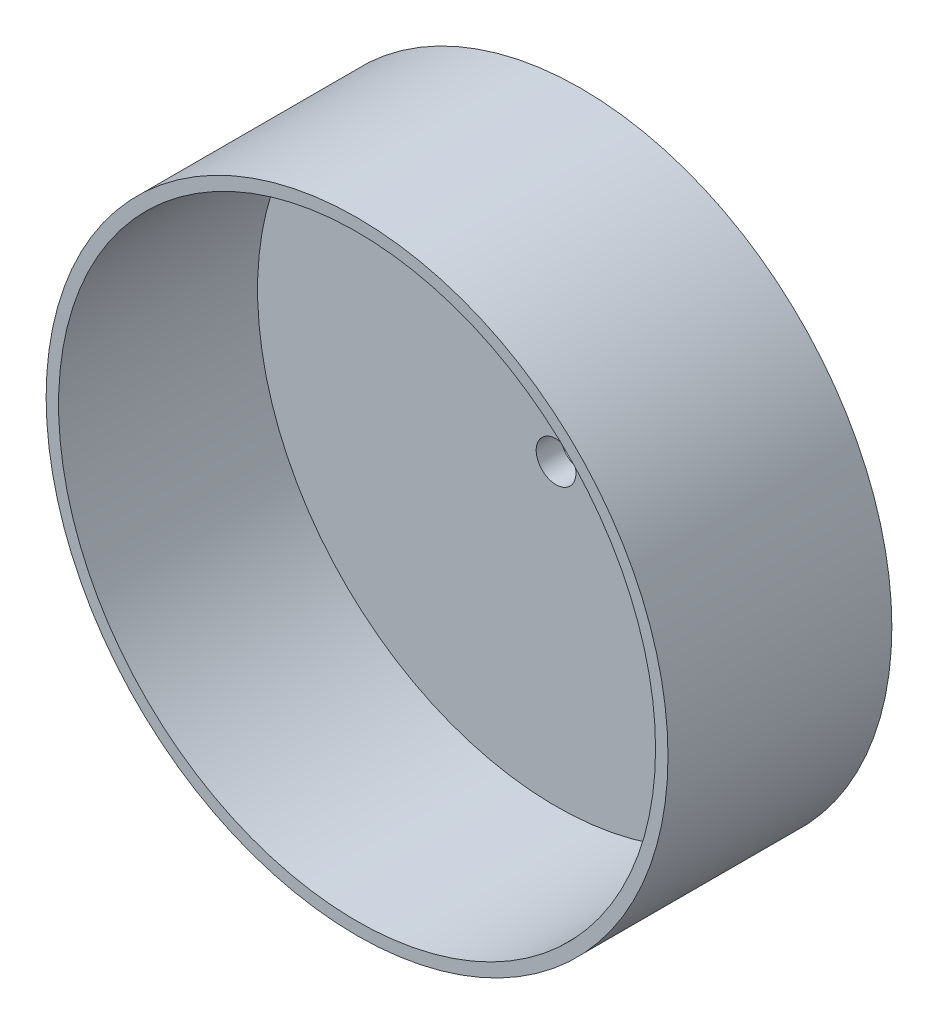
ISO-10303-21;
HEADER;
FILE_DESCRIPTION(('STEP AP214'),'2;1');
FILE_NAME('part.step','',(''),(''),'','','');
FILE_SCHEMA(('AUTOMOTIVE_DESIGN { 1 0 10303 214 1 1 1 1 }'));
ENDSEC;
DATA;
#1=APPLICATION_CONTEXT('core data for automotive mechanical design processes');
#2=APPLICATION_PROTOCOL_DEFINITION('international standard','automotive_design',2000,#1);
#3=PRODUCT_CONTEXT('',#1,'mechanical');
#4=PRODUCT('Part','Part','',(#3));
#5=PRODUCT_RELATED_PRODUCT_CATEGORY('part','',(#4));
#6=PRODUCT_DEFINITION_FORMATION('','',#4);
#7=PRODUCT_DEFINITION_CONTEXT('part definition',#1,'design');
#8=PRODUCT_DEFINITION('design','',#6,#7);
#9=PRODUCT_DEFINITION_SHAPE('','',#8);
#10=(LENGTH_UNIT() NAMED_UNIT(*) SI_UNIT(.MILLI.,.METRE.));
#11=(NAMED_UNIT(*) PLANE_ANGLE_UNIT() SI_UNIT($,.RADIAN.));
#12=(NAMED_UNIT(*) SI_UNIT($,.STERADIAN.) SOLID_ANGLE_UNIT());
#13=UNCERTAINTY_MEASURE_WITH_UNIT(LENGTH_MEASURE(1.E-05),#10,'distance_accuracy_value','');
#14=(GEOMETRIC_REPRESENTATION_CONTEXT(3) GLOBAL_UNCERTAINTY_ASSIGNED_CONTEXT((#13)) GLOBAL_UNIT_ASSIGNED_CONTEXT((#10,
#11,#12)) REPRESENTATION_CONTEXT('',''));
#15=CARTESIAN_POINT('',(0.,0.,0.));
#16=DIRECTION('',(0.,0.,1.));
#17=DIRECTION('',(1.,0.,0.));
#18=AXIS2_PLACEMENT_3D('',#15,#16,#17);
#19=CARTESIAN_POINT('',(0.,0.,45.));
#20=DIRECTION('',(0.,0.,-1.));
#21=DIRECTION('',(-1.,0.,0.));
#22=AXIS2_PLACEMENT_3D('',#19,#20,#21);
#23=CYLINDRICAL_SURFACE('',#22,4.);
#24=CARTESIAN_POINT('',(0.,0.,0.));
#25=DIRECTION('',(0.,0.,1.));
#26=DIRECTION('',(1.,0.,0.));
#27=AXIS2_PLACEMENT_3D('',#24,#25,#26);
#28=CIRCLE('',#27,4.);
#29=CARTESIAN_POINT('',(-4.,0.,0.));
#30=VERTEX_POINT('',#29);
#31=EDGE_CURVE('E52',#30,#30,#28,.T.);
#32=CARTESIAN_POINT('',(0.,0.,5.));
#33=DIRECTION('',(0.,0.,1.));
#34=DIRECTION('',(1.,0.,0.));
#35=AXIS2_PLACEMENT_3D('',#32,#33,#34);
#36=CIRCLE('',#35,4.);
#37=CARTESIAN_POINT('',(-4.,0.,5.));
#38=VERTEX_POINT('',#37);
#39=EDGE_CURVE('E41',#38,#38,#36,.T.);
#40=CARTESIAN_POINT('',(-4.,0.,0.));
#41=CARTESIAN_POINT('',(-4.,0.,0.0520833333333253));
#42=CARTESIAN_POINT('',(-4.,0.,0.104166666666657));
#43=CARTESIAN_POINT('',(-4.,0.,0.208333333333324));
#44=CARTESIAN_POINT('',(-4.,0.,0.260416666666659));
#45=CARTESIAN_POINT('',(-4.,0.,0.364583333333328));
#46=CARTESIAN_POINT('',(-4.,0.,0.416666666666662));
#47=CARTESIAN_POINT('',(-4.,0.,0.520833333333329));
#48=CARTESIAN_POINT('',(-4.,0.,0.572916666666661));
#49=CARTESIAN_POINT('',(-4.,0.,0.677083333333326));
#50=CARTESIAN_POINT('',(-4.,0.,0.729166666666658));
#51=CARTESIAN_POINT('',(-4.,0.,0.833333333333325));
#52=CARTESIAN_POINT('',(-4.,0.,0.885416666666659));
#53=CARTESIAN_POINT('',(-4.,0.,0.989583333333328));
#54=CARTESIAN_POINT('',(-4.,0.,1.04166666666666));
#55=CARTESIAN_POINT('',(-4.,0.,1.14583333333333));
#56=CARTESIAN_POINT('',(-4.,0.,1.19791666666666));
#57=CARTESIAN_POINT('',(-4.,0.,1.30208333333333));
#58=CARTESIAN_POINT('',(-4.,0.,1.35416666666666));
#59=CARTESIAN_POINT('',(-4.,0.,1.45833333333333));
#60=CARTESIAN_POINT('',(-4.,0.,1.51041666666666));
#61=CARTESIAN_POINT('',(-4.,0.,1.61458333333333));
#62=CARTESIAN_POINT('',(-4.,0.,1.66666666666666));
#63=CARTESIAN_POINT('',(-4.,0.,1.77083333333333));
#64=CARTESIAN_POINT('',(-4.,0.,1.82291666666666));
#65=CARTESIAN_POINT('',(-4.,0.,1.92708333333333));
#66=CARTESIAN_POINT('',(-4.,0.,1.97916666666666));
#67=CARTESIAN_POINT('',(-4.,0.,2.08333333333333));
#68=CARTESIAN_POINT('',(-4.,0.,2.13541666666666));
#69=CARTESIAN_POINT('',(-4.,0.,2.23958333333333));
#70=CARTESIAN_POINT('',(-4.,0.,2.29166666666666));
#71=CARTESIAN_POINT('',(-4.,0.,2.39583333333333));
#72=CARTESIAN_POINT('',(-4.,0.,2.44791666666666));
#73=CARTESIAN_POINT('',(-4.,0.,2.55208333333333));
#74=CARTESIAN_POINT('',(-4.,0.,2.60416666666666));
#75=CARTESIAN_POINT('',(-4.,0.,2.70833333333333));
#76=CARTESIAN_POINT('',(-4.,0.,2.76041666666666));
#77=CARTESIAN_POINT('',(-4.,0.,2.86458333333333));
#78=CARTESIAN_POINT('',(-4.,0.,2.91666666666666));
#79=CARTESIAN_POINT('',(-4.,0.,3.02083333333333));
#80=CARTESIAN_POINT('',(-4.,0.,3.07291666666666));
#81=CARTESIAN_POINT('',(-4.,0.,3.17708333333333));
#82=CARTESIAN_POINT('',(-4.,0.,3.22916666666666));
#83=CARTESIAN_POINT('',(-4.,0.,3.33333333333333));
#84=CARTESIAN_POINT('',(-4.,0.,3.38541666666666));
#85=CARTESIAN_POINT('',(-4.,0.,3.48958333333333));
#86=CARTESIAN_POINT('',(-4.,0.,3.54166666666667));
#87=CARTESIAN_POINT('',(-4.,0.,3.64583333333333));
#88=CARTESIAN_POINT('',(-4.,0.,3.69791666666666));
#89=CARTESIAN_POINT('',(-4.,0.,3.80208333333333));
#90=CARTESIAN_POINT('',(-4.,0.,3.85416666666666));
#91=CARTESIAN_POINT('',(-4.,0.,3.95833333333333));
#92=CARTESIAN_POINT('',(-4.,0.,4.01041666666666));
#93=CARTESIAN_POINT('',(-4.,0.,4.11458333333333));
#94=CARTESIAN_POINT('',(-4.,0.,4.16666666666667));
#95=CARTESIAN_POINT('',(-4.,0.,4.27083333333333));
#96=CARTESIAN_POINT('',(-4.,0.,4.32291666666667));
#97=CARTESIAN_POINT('',(-4.,0.,4.42708333333333));
#98=CARTESIAN_POINT('',(-4.,0.,4.47916666666666));
#99=CARTESIAN_POINT('',(-4.,0.,4.58333333333333));
#100=CARTESIAN_POINT('',(-4.,0.,4.63541666666666));
#101=CARTESIAN_POINT('',(-4.,0.,4.73958333333333));
#102=CARTESIAN_POINT('',(-4.,0.,4.79166666666667));
#103=CARTESIAN_POINT('',(-4.,0.,4.89583333333333));
#104=CARTESIAN_POINT('',(-4.,0.,4.94791666666667));
#105=CARTESIAN_POINT('',(-4.,0.,5.));
#106=B_SPLINE_CURVE_WITH_KNOTS('',3,(#40,#41,#42,#43,#44,#45,#46,#47,#48,#49,#50,#51,#52,#53,
#54,#55,#56,#57,#58,#59,#60,#61,#62,#63,#64,#65,#66,#67,#68,#69,#70,#71,#72,#73,#74,#75,#76,#77,
#78,#79,#80,#81,#82,#83,#84,#85,#86,#87,#88,#89,#90,#91,#92,#93,#94,#95,#96,#97,#98,#99,#100,
#101,#102,#103,#104,#105),.UNSPECIFIED.,.F.,.F.,(4,2,2,2,2,2,2,2,2,2,2,2,2,2,2,2,2,2,2,2,2,2,2,
2,2,2,2,2,2,2,2,2,4),(0.,0.156249999999997,0.3125,0.468750000000004,0.625000000000001,
0.781249999999997,0.937500000000001,1.09375,1.25,1.40625,1.5625,1.71875,1.875,2.03125,2.1875,
2.34375000000001,2.5,2.65625,2.8125,2.96875000000001,3.125,3.28125,3.4375,3.59375000000001,3.75,
3.90625,4.0625,4.21875000000001,4.375,4.53125,4.6875,4.84375000000001,5.),.UNSPECIFIED.);
#107=EDGE_CURVE('BSEAM37',#30,#38,#106,.T.);
#108=ORIENTED_EDGE('',*,*,#31,.F.);
#109=ORIENTED_EDGE('',*,*,#39,.T.);
#110=ORIENTED_EDGE('',*,*,#107,.T.);
#111=ORIENTED_EDGE('',*,*,#107,.F.);
#112=EDGE_LOOP('',(#108,#110,#109,#111));
#113=FACE_BOUND('',#112,.T.);
#114=ADVANCED_FACE('F37',(#113),#23,.F.);
#115=CARTESIAN_POINT('',(0.,0.,45.));
#116=DIRECTION('',(0.,0.,1.));
#117=DIRECTION('',(1.,0.,0.));
#118=AXIS2_PLACEMENT_3D('',#115,#116,#117);
#119=PLANE('',#118);
#120=CARTESIAN_POINT('',(0.,0.,45.));
#121=DIRECTION('',(0.,0.,1.));
#122=DIRECTION('',(1.,0.,0.));
#123=AXIS2_PLACEMENT_3D('',#120,#121,#122);
#124=CIRCLE('',#123,60.);
#125=CARTESIAN_POINT('',(60.,0.,45.));
#126=VERTEX_POINT('',#125);
#127=EDGE_CURVE('E57',#126,#126,#124,.T.);
#128=ORIENTED_EDGE('',*,*,#127,.F.);
#129=EDGE_LOOP('',(#128));
#130=FACE_BOUND('',#129,.T.);
#131=CARTESIAN_POINT('',(0.,0.,45.));
#132=DIRECTION('',(0.,0.,1.));
#133=DIRECTION('',(1.,0.,0.));
#134=AXIS2_PLACEMENT_3D('',#131,#132,#133);
#135=CIRCLE('',#134,62.5);
#136=CARTESIAN_POINT('',(-62.5,0.,45.));
#137=VERTEX_POINT('',#136);
#138=EDGE_CURVE('E10',#137,#137,#135,.T.);
#139=ORIENTED_EDGE('',*,*,#138,.T.);
#140=EDGE_LOOP('',(#139));
#141=FACE_BOUND('',#140,.T.);
#142=ADVANCED_FACE('F81',(#130,#141),#119,.T.);
#143=CARTESIAN_POINT('',(0.,0.,0.));
#144=DIRECTION('',(0.,0.,1.));
#145=DIRECTION('',(1.,0.,0.));
#146=AXIS2_PLACEMENT_3D('',#143,#144,#145);
#147=PLANE('',#146);
#148=CARTESIAN_POINT('',(0.,0.,0.));
#149=DIRECTION('',(0.,0.,1.));
#150=DIRECTION('',(1.,0.,0.));
#151=AXIS2_PLACEMENT_3D('',#148,#149,#150);
#152=CIRCLE('',#151,62.5);
#153=CARTESIAN_POINT('',(-62.5,0.,0.));
#154=VERTEX_POINT('',#153);
#155=EDGE_CURVE('E46',#154,#154,#152,.T.);
#156=ORIENTED_EDGE('',*,*,#155,.F.);
#157=EDGE_LOOP('',(#156));
#158=FACE_BOUND('',#157,.T.);
#159=ORIENTED_EDGE('',*,*,#31,.T.);
#160=EDGE_LOOP('',(#159));
#161=FACE_BOUND('',#160,.T.);
#162=ADVANCED_FACE('F87',(#158,#161),#147,.F.);
#163=CARTESIAN_POINT('',(0.,0.,45.));
#164=DIRECTION('',(0.,0.,-1.));
#165=DIRECTION('',(-1.,0.,0.));
#166=AXIS2_PLACEMENT_3D('',#163,#164,#165);
#167=CYLINDRICAL_SURFACE('',#166,62.5);
#168=CARTESIAN_POINT('',(-62.5,0.,45.));
#169=CARTESIAN_POINT('',(-62.5,0.,44.53125));
#170=CARTESIAN_POINT('',(-62.5,0.,44.0625));
#171=CARTESIAN_POINT('',(-62.5,0.,43.125));
#172=CARTESIAN_POINT('',(-62.5,0.,42.65625));
#173=CARTESIAN_POINT('',(-62.5,0.,41.71875));
#174=CARTESIAN_POINT('',(-62.5,0.,41.25));
#175=CARTESIAN_POINT('',(-62.5,0.,40.3125));
#176=CARTESIAN_POINT('',(-62.5,0.,39.84375));
#177=CARTESIAN_POINT('',(-62.5,0.,38.90625));
#178=CARTESIAN_POINT('',(-62.5,0.,38.4375));
#179=CARTESIAN_POINT('',(-62.5,0.,37.5));
#180=CARTESIAN_POINT('',(-62.5,0.,37.03125));
#181=CARTESIAN_POINT('',(-62.5,0.,36.09375));
#182=CARTESIAN_POINT('',(-62.5,0.,35.625));
#183=CARTESIAN_POINT('',(-62.5,0.,34.6875));
#184=CARTESIAN_POINT('',(-62.5,0.,34.21875));
#185=CARTESIAN_POINT('',(-62.5,0.,33.28125));
#186=CARTESIAN_POINT('',(-62.5,0.,32.8125));
#187=CARTESIAN_POINT('',(-62.5,0.,31.875));
#188=CARTESIAN_POINT('',(-62.5,0.,31.40625));
#189=CARTESIAN_POINT('',(-62.5,0.,30.46875));
#190=CARTESIAN_POINT('',(-62.5,0.,30.));
#191=CARTESIAN_POINT('',(-62.5,0.,29.0625));
#192=CARTESIAN_POINT('',(-62.5,0.,28.59375));
#193=CARTESIAN_POINT('',(-62.5,0.,27.65625));
#194=CARTESIAN_POINT('',(-62.5,0.,27.1875));
#195=CARTESIAN_POINT('',(-62.5,0.,26.25));
#196=CARTESIAN_POINT('',(-62.5,0.,25.78125));
#197=CARTESIAN_POINT('',(-62.5,0.,24.84375));
#198=CARTESIAN_POINT('',(-62.5,0.,24.375));
#199=CARTESIAN_POINT('',(-62.5,0.,23.4375));
#200=CARTESIAN_POINT('',(-62.5,0.,22.96875));
#201=CARTESIAN_POINT('',(-62.5,0.,22.03125));
#202=CARTESIAN_POINT('',(-62.5,0.,21.5625));
#203=CARTESIAN_POINT('',(-62.5,0.,20.625));
#204=CARTESIAN_POINT('',(-62.5,0.,20.15625));
#205=CARTESIAN_POINT('',(-62.5,0.,19.21875));
#206=CARTESIAN_POINT('',(-62.5,0.,18.75));
#207=CARTESIAN_POINT('',(-62.5,0.,17.8125));
#208=CARTESIAN_POINT('',(-62.5,0.,17.34375));
#209=CARTESIAN_POINT('',(-62.5,0.,16.40625));
#210=CARTESIAN_POINT('',(-62.5,0.,15.9375));
#211=CARTESIAN_POINT('',(-62.5,0.,15.));
#212=CARTESIAN_POINT('',(-62.5,0.,14.53125));
#213=CARTESIAN_POINT('',(-62.5,0.,13.59375));
#214=CARTESIAN_POINT('',(-62.5,0.,13.125));
#215=CARTESIAN_POINT('',(-62.5,0.,12.1875));
#216=CARTESIAN_POINT('',(-62.5,0.,11.71875));
#217=CARTESIAN_POINT('',(-62.5,0.,10.78125));
#218=CARTESIAN_POINT('',(-62.5,0.,10.3125));
#219=CARTESIAN_POINT('',(-62.5,0.,9.37499999999999));
#220=CARTESIAN_POINT('',(-62.5,0.,8.90624999999999));
#221=CARTESIAN_POINT('',(-62.5,0.,7.96874999999999));
#222=CARTESIAN_POINT('',(-62.5,0.,7.5));
#223=CARTESIAN_POINT('',(-62.5,0.,6.56249999999999));
#224=CARTESIAN_POINT('',(-62.5,0.,6.09374999999999));
#225=CARTESIAN_POINT('',(-62.5,0.,5.15624999999999));
#226=CARTESIAN_POINT('',(-62.5,0.,4.68749999999999));
#227=CARTESIAN_POINT('',(-62.5,0.,3.74999999999999));
#228=CARTESIAN_POINT('',(-62.5,0.,3.28124999999999));
#229=CARTESIAN_POINT('',(-62.5,0.,2.34374999999999));
#230=CARTESIAN_POINT('',(-62.5,0.,1.87499999999999));
#231=CARTESIAN_POINT('',(-62.5,0.,0.937499999999992));
#232=CARTESIAN_POINT('',(-62.5,0.,0.468749999999993));
#233=CARTESIAN_POINT('',(-62.5,0.,0.));
#234=B_SPLINE_CURVE_WITH_KNOTS('',3,(#168,#169,#170,#171,#172,#173,#174,#175,#176,#177,#178,
#179,#180,#181,#182,#183,#184,#185,#186,#187,#188,#189,#190,#191,#192,#193,#194,#195,#196,#197,
#198,#199,#200,#201,#202,#203,#204,#205,#206,#207,#208,#209,#210,#211,#212,#213,#214,#215,#216,
#217,#218,#219,#220,#221,#222,#223,#224,#225,#226,#227,#228,#229,#230,#231,#232,#233),
.UNSPECIFIED.,.F.,.F.,(4,2,2,2,2,2,2,2,2,2,2,2,2,2,2,2,2,2,2,2,2,2,2,2,2,2,2,2,2,2,2,2,4),(0.,
1.40625,2.8125,4.21874999999999,5.625,7.03125,8.43749999999999,9.84375,11.25,12.65625,14.0625,
15.46875,16.875,18.28125,19.6875,21.09375,22.5,23.90625,25.3125,26.71875,28.125,29.53125,
30.9375,32.34375,33.75,35.15625,36.5625,37.96875,39.375,40.78125,42.1875,43.59375,45.),.UNSPECIFIED.);
#235=EDGE_CURVE('BSEAM39',#137,#154,#234,.T.);
#236=ORIENTED_EDGE('',*,*,#138,.F.);
#237=ORIENTED_EDGE('',*,*,#155,.T.);
#238=ORIENTED_EDGE('',*,*,#235,.T.);
#239=ORIENTED_EDGE('',*,*,#235,.F.);
#240=EDGE_LOOP('',(#236,#238,#237,#239));
#241=FACE_BOUND('',#240,.T.);
#242=ADVANCED_FACE('F39',(#241),#167,.T.);
#243=CARTESIAN_POINT('',(0.,0.,5.));
#244=DIRECTION('',(0.,0.,1.));
#245=DIRECTION('',(1.,0.,0.));
#246=AXIS2_PLACEMENT_3D('',#243,#244,#245);
#247=CYLINDRICAL_SURFACE('',#246,60.);
#248=CARTESIAN_POINT('',(0.,0.,5.));
#249=DIRECTION('',(0.,0.,1.));
#250=DIRECTION('',(1.,0.,0.));
#251=AXIS2_PLACEMENT_3D('',#248,#249,#250);
#252=CIRCLE('',#251,60.);
#253=CARTESIAN_POINT('',(60.,0.,5.));
#254=VERTEX_POINT('',#253);
#255=EDGE_CURVE('E61',#254,#254,#252,.T.);
#256=ORIENTED_EDGE('',*,*,#255,.F.);
#257=EDGE_LOOP('',(#256));
#258=FACE_BOUND('',#257,.T.);
#259=ORIENTED_EDGE('',*,*,#127,.T.);
#260=EDGE_LOOP('',(#259));
#261=FACE_BOUND('',#260,.T.);
#262=ADVANCED_FACE('F73',(#258,#261),#247,.F.);
#263=CARTESIAN_POINT('',(0.,0.,5.));
#264=DIRECTION('',(0.,0.,1.));
#265=DIRECTION('',(1.,0.,0.));
#266=AXIS2_PLACEMENT_3D('',#263,#264,#265);
#267=PLANE('',#266);
#268=ORIENTED_EDGE('',*,*,#39,.F.);
#269=EDGE_LOOP('',(#268));
#270=FACE_BOUND('',#269,.T.);
#271=ORIENTED_EDGE('',*,*,#255,.T.);
#272=EDGE_LOOP('',(#271));
#273=FACE_BOUND('',#272,.T.);
#274=ADVANCED_FACE('F71',(#270,#273),#267,.T.);
#275=CLOSED_SHELL('',(#114,#142,#162,#242,#262,#274));
#276=MANIFOLD_SOLID_BREP('B2',#275);
#277=ADVANCED_BREP_SHAPE_REPRESENTATION('',(#18,#276),#14);
#278=SHAPE_DEFINITION_REPRESENTATION(#9,#277);
ENDSEC;
END-ISO-10303-21;
